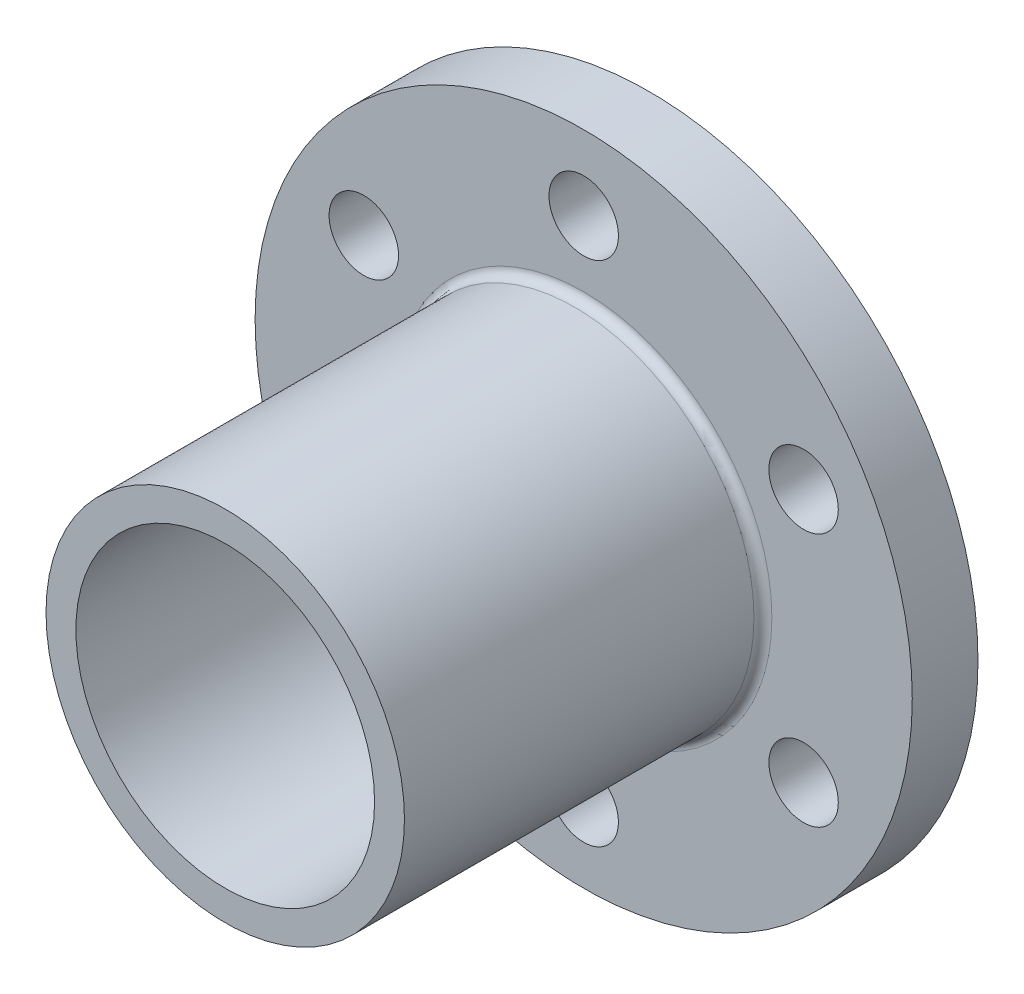
ISO-10303-21;
HEADER;
FILE_DESCRIPTION(('STEP AP214'),'2;1');
FILE_NAME('part.step','',(''),(''),'','','');
FILE_SCHEMA(('AUTOMOTIVE_DESIGN { 1 0 10303 214 1 1 1 1 }'));
ENDSEC;
DATA;
#1=APPLICATION_CONTEXT('core data for automotive mechanical design processes');
#2=APPLICATION_PROTOCOL_DEFINITION('international standard','automotive_design',2000,#1);
#3=PRODUCT_CONTEXT('',#1,'mechanical');
#4=PRODUCT('Part','Part','',(#3));
#5=PRODUCT_RELATED_PRODUCT_CATEGORY('part','',(#4));
#6=PRODUCT_DEFINITION_FORMATION('','',#4);
#7=PRODUCT_DEFINITION_CONTEXT('part definition',#1,'design');
#8=PRODUCT_DEFINITION('design','',#6,#7);
#9=PRODUCT_DEFINITION_SHAPE('','',#8);
#10=(LENGTH_UNIT() NAMED_UNIT(*) SI_UNIT(.MILLI.,.METRE.));
#11=(NAMED_UNIT(*) PLANE_ANGLE_UNIT() SI_UNIT($,.RADIAN.));
#12=(NAMED_UNIT(*) SI_UNIT($,.STERADIAN.) SOLID_ANGLE_UNIT());
#13=UNCERTAINTY_MEASURE_WITH_UNIT(LENGTH_MEASURE(1.E-05),#10,'distance_accuracy_value','');
#14=(GEOMETRIC_REPRESENTATION_CONTEXT(3) GLOBAL_UNCERTAINTY_ASSIGNED_CONTEXT((#13)) GLOBAL_UNIT_ASSIGNED_CONTEXT((#10,
#11,#12)) REPRESENTATION_CONTEXT('',''));
#15=CARTESIAN_POINT('',(0.,0.,0.));
#16=DIRECTION('',(0.,0.,1.));
#17=DIRECTION('',(1.,0.,0.));
#18=AXIS2_PLACEMENT_3D('',#15,#16,#17);
#19=CARTESIAN_POINT('',(0.,0.,22.));
#20=DIRECTION('',(0.,0.,-1.));
#21=DIRECTION('',(-1.,0.,0.));
#22=AXIS2_PLACEMENT_3D('',#19,#20,#21);
#23=CYLINDRICAL_SURFACE('',#22,110.);
#24=CARTESIAN_POINT('',(0.,0.,22.));
#25=DIRECTION('',(0.,0.,1.));
#26=DIRECTION('',(1.,0.,0.));
#27=AXIS2_PLACEMENT_3D('',#24,#25,#26);
#28=CIRCLE('',#27,110.);
#29=CARTESIAN_POINT('',(110.,0.,22.));
#30=VERTEX_POINT('',#29);
#31=EDGE_CURVE('E52',#30,#30,#28,.T.);
#32=ORIENTED_EDGE('',*,*,#31,.F.);
#33=EDGE_LOOP('',(#32));
#34=FACE_BOUND('',#33,.T.);
#35=CARTESIAN_POINT('',(0.,0.,0.));
#36=DIRECTION('',(0.,0.,1.));
#37=DIRECTION('',(1.,0.,0.));
#38=AXIS2_PLACEMENT_3D('',#35,#36,#37);
#39=CIRCLE('',#38,110.);
#40=CARTESIAN_POINT('',(110.,0.,0.));
#41=VERTEX_POINT('',#40);
#42=EDGE_CURVE('E57',#41,#41,#39,.T.);
#43=ORIENTED_EDGE('',*,*,#42,.T.);
#44=EDGE_LOOP('',(#43));
#45=FACE_BOUND('',#44,.T.);
#46=ADVANCED_FACE('F39',(#34,#45),#23,.T.);
#47=CARTESIAN_POINT('',(0.,0.,22.));
#48=DIRECTION('',(0.,0.,1.));
#49=DIRECTION('',(1.,0.,0.));
#50=AXIS2_PLACEMENT_3D('',#47,#48,#49);
#51=PLANE('',#50);
#52=CARTESIAN_POINT('',(0.,0.,22.));
#53=DIRECTION('',(0.,0.,1.));
#54=DIRECTION('',(1.,0.,0.));
#55=AXIS2_PLACEMENT_3D('',#52,#53,#54);
#56=CIRCLE('',#55,63.);
#57=CARTESIAN_POINT('',(63.,0.,22.));
#58=VERTEX_POINT('',#57);
#59=EDGE_CURVE('E10',#58,#58,#56,.F.);
#60=ORIENTED_EDGE('',*,*,#59,.T.);
#61=EDGE_LOOP('',(#60));
#62=FACE_BOUND('',#61,.T.);
#63=CARTESIAN_POINT('',(0.,85.,22.));
#64=DIRECTION('',(0.,0.,1.));
#65=DIRECTION('',(1.,0.,0.));
#66=AXIS2_PLACEMENT_3D('',#63,#64,#65);
#67=CIRCLE('',#66,11.6234480806694);
#68=CARTESIAN_POINT('',(11.6234480806694,85.,22.));
#69=VERTEX_POINT('',#68);
#70=EDGE_CURVE('E109',#69,#69,#67,.T.);
#71=ORIENTED_EDGE('',*,*,#70,.F.);
#72=EDGE_LOOP('',(#71));
#73=FACE_BOUND('',#72,.T.);
#74=CARTESIAN_POINT('',(-73.6121593216749,42.4999999999958,22.));
#75=DIRECTION('',(0.,0.,1.));
#76=DIRECTION('',(1.,0.,0.));
#77=AXIS2_PLACEMENT_3D('',#74,#75,#76);
#78=CIRCLE('',#77,11.623448080674);
#79=CARTESIAN_POINT('',(-61.988711241001,42.4999999999958,22.));
#80=VERTEX_POINT('',#79);
#81=EDGE_CURVE('E110',#80,#80,#78,.T.);
#82=ORIENTED_EDGE('',*,*,#81,.F.);
#83=EDGE_LOOP('',(#82));
#84=FACE_BOUND('',#83,.T.);
#85=CARTESIAN_POINT('',(-73.6121593216701,-42.5000000000042,22.));
#86=DIRECTION('',(0.,0.,1.));
#87=DIRECTION('',(1.,0.,0.));
#88=AXIS2_PLACEMENT_3D('',#85,#86,#87);
#89=CIRCLE('',#88,11.6234480806783);
#90=CARTESIAN_POINT('',(-61.9887112409917,-42.5000000000042,22.));
#91=VERTEX_POINT('',#90);
#92=EDGE_CURVE('E76',#91,#91,#89,.T.);
#93=ORIENTED_EDGE('',*,*,#92,.F.);
#94=EDGE_LOOP('',(#93));
#95=FACE_BOUND('',#94,.T.);
#96=CARTESIAN_POINT('',(9.63215271295911E-12,-85.,22.));
#97=DIRECTION('',(0.,0.,1.));
#98=DIRECTION('',(1.,0.,0.));
#99=AXIS2_PLACEMENT_3D('',#96,#97,#98);
#100=CIRCLE('',#99,11.6234480806792);
#101=CARTESIAN_POINT('',(11.6234480806889,-85.,22.));
#102=VERTEX_POINT('',#101);
#103=EDGE_CURVE('E85',#102,#102,#100,.T.);
#104=ORIENTED_EDGE('',*,*,#103,.F.);
#105=EDGE_LOOP('',(#104));
#106=FACE_BOUND('',#105,.T.);
#107=CARTESIAN_POINT('',(73.6121593216845,-42.4999999999958,22.));
#108=DIRECTION('',(0.,0.,1.));
#109=DIRECTION('',(1.,0.,0.));
#110=AXIS2_PLACEMENT_3D('',#107,#108,#109);
#111=CIRCLE('',#110,11.6234480806755);
#112=CARTESIAN_POINT('',(85.23560740236,-42.4999999999958,22.));
#113=VERTEX_POINT('',#112);
#114=EDGE_CURVE('E93',#113,#113,#111,.T.);
#115=ORIENTED_EDGE('',*,*,#114,.F.);
#116=EDGE_LOOP('',(#115));
#117=FACE_BOUND('',#116,.T.);
#118=CARTESIAN_POINT('',(73.6121593216797,42.5000000000042,22.));
#119=DIRECTION('',(0.,0.,1.));
#120=DIRECTION('',(1.,0.,0.));
#121=AXIS2_PLACEMENT_3D('',#118,#119,#120);
#122=CIRCLE('',#121,11.6234480806707);
#123=CARTESIAN_POINT('',(85.2356074023504,42.5000000000042,22.));
#124=VERTEX_POINT('',#123);
#125=EDGE_CURVE('E101',#124,#124,#122,.T.);
#126=ORIENTED_EDGE('',*,*,#125,.F.);
#127=EDGE_LOOP('',(#126));
#128=FACE_BOUND('',#127,.T.);
#129=ORIENTED_EDGE('',*,*,#31,.T.);
#130=EDGE_LOOP('',(#129));
#131=FACE_BOUND('',#130,.T.);
#132=ADVANCED_FACE('F134',(#62,#73,#84,#95,#106,#117,#128,#131),#51,.T.);
#133=CARTESIAN_POINT('',(0.,0.,0.));
#134=DIRECTION('',(0.,0.,1.));
#135=DIRECTION('',(1.,0.,0.));
#136=AXIS2_PLACEMENT_3D('',#133,#134,#135);
#137=PLANE('',#136);
#138=CARTESIAN_POINT('',(0.,85.,0.));
#139=DIRECTION('',(0.,0.,1.));
#140=DIRECTION('',(1.,0.,0.));
#141=AXIS2_PLACEMENT_3D('',#138,#139,#140);
#142=CIRCLE('',#141,11.6234480806694);
#143=CARTESIAN_POINT('',(11.6234480806694,85.,0.));
#144=VERTEX_POINT('',#143);
#145=EDGE_CURVE('E72',#144,#144,#142,.T.);
#146=ORIENTED_EDGE('',*,*,#145,.T.);
#147=EDGE_LOOP('',(#146));
#148=FACE_BOUND('',#147,.T.);
#149=CARTESIAN_POINT('',(-73.6121593216749,42.4999999999958,0.));
#150=DIRECTION('',(0.,0.,1.));
#151=DIRECTION('',(1.,0.,0.));
#152=AXIS2_PLACEMENT_3D('',#149,#150,#151);
#153=CIRCLE('',#152,11.623448080674);
#154=CARTESIAN_POINT('',(-61.988711241001,42.4999999999958,0.));
#155=VERTEX_POINT('',#154);
#156=EDGE_CURVE('E81',#155,#155,#153,.T.);
#157=ORIENTED_EDGE('',*,*,#156,.T.);
#158=EDGE_LOOP('',(#157));
#159=FACE_BOUND('',#158,.T.);
#160=CARTESIAN_POINT('',(-73.6121593216701,-42.5000000000042,0.));
#161=DIRECTION('',(0.,0.,1.));
#162=DIRECTION('',(1.,0.,0.));
#163=AXIS2_PLACEMENT_3D('',#160,#161,#162);
#164=CIRCLE('',#163,11.6234480806783);
#165=CARTESIAN_POINT('',(-61.9887112409917,-42.5000000000042,0.));
#166=VERTEX_POINT('',#165);
#167=EDGE_CURVE('E80',#166,#166,#164,.T.);
#168=ORIENTED_EDGE('',*,*,#167,.T.);
#169=EDGE_LOOP('',(#168));
#170=FACE_BOUND('',#169,.T.);
#171=CARTESIAN_POINT('',(9.63215271295911E-12,-85.,0.));
#172=DIRECTION('',(0.,0.,1.));
#173=DIRECTION('',(1.,0.,0.));
#174=AXIS2_PLACEMENT_3D('',#171,#172,#173);
#175=CIRCLE('',#174,11.6234480806792);
#176=CARTESIAN_POINT('',(11.6234480806889,-85.,0.));
#177=VERTEX_POINT('',#176);
#178=EDGE_CURVE('E89',#177,#177,#175,.T.);
#179=ORIENTED_EDGE('',*,*,#178,.T.);
#180=EDGE_LOOP('',(#179));
#181=FACE_BOUND('',#180,.T.);
#182=CARTESIAN_POINT('',(73.6121593216845,-42.4999999999958,0.));
#183=DIRECTION('',(0.,0.,1.));
#184=DIRECTION('',(1.,0.,0.));
#185=AXIS2_PLACEMENT_3D('',#182,#183,#184);
#186=CIRCLE('',#185,11.6234480806755);
#187=CARTESIAN_POINT('',(85.23560740236,-42.4999999999958,0.));
#188=VERTEX_POINT('',#187);
#189=EDGE_CURVE('E97',#188,#188,#186,.T.);
#190=ORIENTED_EDGE('',*,*,#189,.T.);
#191=EDGE_LOOP('',(#190));
#192=FACE_BOUND('',#191,.T.);
#193=CARTESIAN_POINT('',(73.6121593216797,42.5000000000042,0.));
#194=DIRECTION('',(0.,0.,1.));
#195=DIRECTION('',(1.,0.,0.));
#196=AXIS2_PLACEMENT_3D('',#193,#194,#195);
#197=CIRCLE('',#196,11.6234480806707);
#198=CARTESIAN_POINT('',(85.2356074023504,42.5000000000042,0.));
#199=VERTEX_POINT('',#198);
#200=EDGE_CURVE('E105',#199,#199,#197,.T.);
#201=ORIENTED_EDGE('',*,*,#200,.T.);
#202=EDGE_LOOP('',(#201));
#203=FACE_BOUND('',#202,.T.);
#204=CARTESIAN_POINT('',(0.,0.,0.));
#205=DIRECTION('',(0.,0.,1.));
#206=DIRECTION('',(1.,0.,0.));
#207=AXIS2_PLACEMENT_3D('',#204,#205,#206);
#208=CIRCLE('',#207,50.);
#209=CARTESIAN_POINT('',(50.,0.,0.));
#210=VERTEX_POINT('',#209);
#211=EDGE_CURVE('E67',#210,#210,#208,.T.);
#212=ORIENTED_EDGE('',*,*,#211,.T.);
#213=EDGE_LOOP('',(#212));
#214=FACE_BOUND('',#213,.T.);
#215=ORIENTED_EDGE('',*,*,#42,.F.);
#216=EDGE_LOOP('',(#215));
#217=FACE_BOUND('',#216,.T.);
#218=ADVANCED_FACE('F124',(#148,#159,#170,#181,#192,#203,#214,#217),#137,.F.);
#219=CARTESIAN_POINT('',(0.,0.,142.));
#220=DIRECTION('',(0.,0.,-1.));
#221=DIRECTION('',(-1.,0.,0.));
#222=AXIS2_PLACEMENT_3D('',#219,#220,#221);
#223=CYLINDRICAL_SURFACE('',#222,60.);
#224=CARTESIAN_POINT('',(0.,0.,25.));
#225=DIRECTION('',(0.,0.,1.));
#226=DIRECTION('',(1.,0.,0.));
#227=AXIS2_PLACEMENT_3D('',#224,#225,#226);
#228=CIRCLE('',#227,60.);
#229=CARTESIAN_POINT('',(60.,0.,25.));
#230=VERTEX_POINT('',#229);
#231=EDGE_CURVE('E47',#230,#230,#228,.T.);
#232=ORIENTED_EDGE('',*,*,#231,.T.);
#233=EDGE_LOOP('',(#232));
#234=FACE_BOUND('',#233,.T.);
#235=CARTESIAN_POINT('',(0.,0.,142.));
#236=DIRECTION('',(0.,0.,1.));
#237=DIRECTION('',(1.,0.,0.));
#238=AXIS2_PLACEMENT_3D('',#235,#236,#237);
#239=CIRCLE('',#238,60.);
#240=CARTESIAN_POINT('',(60.,0.,142.));
#241=VERTEX_POINT('',#240);
#242=EDGE_CURVE('E62',#241,#241,#239,.T.);
#243=ORIENTED_EDGE('',*,*,#242,.F.);
#244=EDGE_LOOP('',(#243));
#245=FACE_BOUND('',#244,.T.);
#246=ADVANCED_FACE('F155',(#234,#245),#223,.T.);
#247=CARTESIAN_POINT('',(0.,0.,142.));
#248=DIRECTION('',(0.,0.,1.));
#249=DIRECTION('',(1.,0.,0.));
#250=AXIS2_PLACEMENT_3D('',#247,#248,#249);
#251=PLANE('',#250);
#252=CARTESIAN_POINT('',(0.,0.,142.));
#253=DIRECTION('',(0.,0.,1.));
#254=DIRECTION('',(1.,0.,0.));
#255=AXIS2_PLACEMENT_3D('',#252,#253,#254);
#256=CIRCLE('',#255,50.);
#257=CARTESIAN_POINT('',(50.,0.,142.));
#258=VERTEX_POINT('',#257);
#259=EDGE_CURVE('E68',#258,#258,#256,.T.);
#260=ORIENTED_EDGE('',*,*,#259,.F.);
#261=EDGE_LOOP('',(#260));
#262=FACE_BOUND('',#261,.T.);
#263=ORIENTED_EDGE('',*,*,#242,.T.);
#264=EDGE_LOOP('',(#263));
#265=FACE_BOUND('',#264,.T.);
#266=ADVANCED_FACE('F160',(#262,#265),#251,.T.);
#267=CARTESIAN_POINT('',(0.,0.,0.));
#268=DIRECTION('',(0.,0.,1.));
#269=DIRECTION('',(1.,0.,0.));
#270=AXIS2_PLACEMENT_3D('',#267,#268,#269);
#271=CYLINDRICAL_SURFACE('',#270,50.);
#272=ORIENTED_EDGE('',*,*,#211,.F.);
#273=EDGE_LOOP('',(#272));
#274=FACE_BOUND('',#273,.T.);
#275=ORIENTED_EDGE('',*,*,#259,.T.);
#276=EDGE_LOOP('',(#275));
#277=FACE_BOUND('',#276,.T.);
#278=ADVANCED_FACE('F165',(#274,#277),#271,.F.);
#279=CARTESIAN_POINT('',(73.6121593216797,42.5000000000042,0.));
#280=DIRECTION('',(0.,0.,1.));
#281=DIRECTION('',(1.,0.,0.));
#282=AXIS2_PLACEMENT_3D('',#279,#280,#281);
#283=CYLINDRICAL_SURFACE('',#282,11.6234480806707);
#284=ORIENTED_EDGE('',*,*,#200,.F.);
#285=EDGE_LOOP('',(#284));
#286=FACE_BOUND('',#285,.T.);
#287=ORIENTED_EDGE('',*,*,#125,.T.);
#288=EDGE_LOOP('',(#287));
#289=FACE_BOUND('',#288,.T.);
#290=ADVANCED_FACE('F169',(#286,#289),#283,.F.);
#291=CARTESIAN_POINT('',(73.6121593216845,-42.4999999999958,0.));
#292=DIRECTION('',(0.,0.,1.));
#293=DIRECTION('',(1.,0.,0.));
#294=AXIS2_PLACEMENT_3D('',#291,#292,#293);
#295=CYLINDRICAL_SURFACE('',#294,11.6234480806755);
#296=ORIENTED_EDGE('',*,*,#189,.F.);
#297=EDGE_LOOP('',(#296));
#298=FACE_BOUND('',#297,.T.);
#299=ORIENTED_EDGE('',*,*,#114,.T.);
#300=EDGE_LOOP('',(#299));
#301=FACE_BOUND('',#300,.T.);
#302=ADVANCED_FACE('F178',(#298,#301),#295,.F.);
#303=CARTESIAN_POINT('',(9.63215271295911E-12,-85.,0.));
#304=DIRECTION('',(0.,0.,1.));
#305=DIRECTION('',(1.,0.,0.));
#306=AXIS2_PLACEMENT_3D('',#303,#304,#305);
#307=CYLINDRICAL_SURFACE('',#306,11.6234480806792);
#308=ORIENTED_EDGE('',*,*,#178,.F.);
#309=EDGE_LOOP('',(#308));
#310=FACE_BOUND('',#309,.T.);
#311=ORIENTED_EDGE('',*,*,#103,.T.);
#312=EDGE_LOOP('',(#311));
#313=FACE_BOUND('',#312,.T.);
#314=ADVANCED_FACE('F174',(#310,#313),#307,.F.);
#315=CARTESIAN_POINT('',(-73.6121593216701,-42.5000000000042,0.));
#316=DIRECTION('',(0.,0.,1.));
#317=DIRECTION('',(1.,0.,0.));
#318=AXIS2_PLACEMENT_3D('',#315,#316,#317);
#319=CYLINDRICAL_SURFACE('',#318,11.6234480806783);
#320=ORIENTED_EDGE('',*,*,#167,.F.);
#321=EDGE_LOOP('',(#320));
#322=FACE_BOUND('',#321,.T.);
#323=ORIENTED_EDGE('',*,*,#92,.T.);
#324=EDGE_LOOP('',(#323));
#325=FACE_BOUND('',#324,.T.);
#326=ADVANCED_FACE('F171',(#322,#325),#319,.F.);
#327=CARTESIAN_POINT('',(-73.6121593216749,42.4999999999958,0.));
#328=DIRECTION('',(0.,0.,1.));
#329=DIRECTION('',(1.,0.,0.));
#330=AXIS2_PLACEMENT_3D('',#327,#328,#329);
#331=CYLINDRICAL_SURFACE('',#330,11.623448080674);
#332=ORIENTED_EDGE('',*,*,#156,.F.);
#333=EDGE_LOOP('',(#332));
#334=FACE_BOUND('',#333,.T.);
#335=ORIENTED_EDGE('',*,*,#81,.T.);
#336=EDGE_LOOP('',(#335));
#337=FACE_BOUND('',#336,.T.);
#338=ADVANCED_FACE('F130',(#334,#337),#331,.F.);
#339=CARTESIAN_POINT('',(0.,85.,0.));
#340=DIRECTION('',(0.,0.,1.));
#341=DIRECTION('',(1.,0.,0.));
#342=AXIS2_PLACEMENT_3D('',#339,#340,#341);
#343=CYLINDRICAL_SURFACE('',#342,11.6234480806694);
#344=ORIENTED_EDGE('',*,*,#145,.F.);
#345=EDGE_LOOP('',(#344));
#346=FACE_BOUND('',#345,.T.);
#347=ORIENTED_EDGE('',*,*,#70,.T.);
#348=EDGE_LOOP('',(#347));
#349=FACE_BOUND('',#348,.T.);
#350=ADVANCED_FACE('F127',(#346,#349),#343,.F.);
#351=CARTESIAN_POINT('',(0.,0.,25.));
#352=DIRECTION('',(0.,0.,1.));
#353=DIRECTION('',(1.,0.,0.));
#354=AXIS2_PLACEMENT_3D('',#351,#352,#353);
#355=TOROIDAL_SURFACE('',#354,63.,3.);
#356=ORIENTED_EDGE('',*,*,#59,.F.);
#357=EDGE_LOOP('',(#356));
#358=FACE_BOUND('',#357,.T.);
#359=ORIENTED_EDGE('',*,*,#231,.F.);
#360=EDGE_LOOP('',(#359));
#361=FACE_BOUND('',#360,.T.);
#362=ADVANCED_FACE('F41',(#358,#361),#355,.F.);
#363=CLOSED_SHELL('',(#46,#132,#218,#246,#266,#278,#290,#302,#314,#326,#338,#350,#362));
#364=MANIFOLD_SOLID_BREP('B2',#363);
#365=ADVANCED_BREP_SHAPE_REPRESENTATION('',(#18,#364),#14);
#366=SHAPE_DEFINITION_REPRESENTATION(#9,#365);
ENDSEC;
END-ISO-10303-21;
